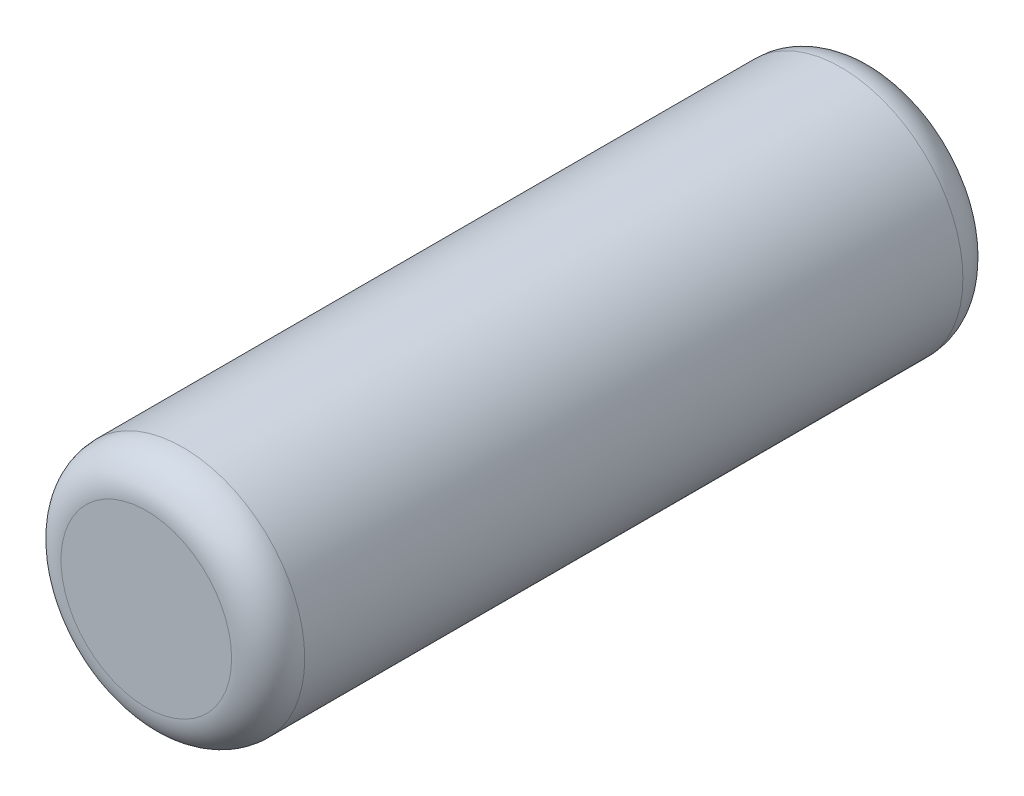
ISO-10303-21;
HEADER;
FILE_DESCRIPTION(('STEP AP214'),'2;1');
FILE_NAME('part.step','',(''),(''),'','','');
FILE_SCHEMA(('AUTOMOTIVE_DESIGN { 1 0 10303 214 1 1 1 1 }'));
ENDSEC;
DATA;
#1=APPLICATION_CONTEXT('core data for automotive mechanical design processes');
#2=APPLICATION_PROTOCOL_DEFINITION('international standard','automotive_design',2000,#1);
#3=PRODUCT_CONTEXT('',#1,'mechanical');
#4=PRODUCT('Part','Part','',(#3));
#5=PRODUCT_RELATED_PRODUCT_CATEGORY('part','',(#4));
#6=PRODUCT_DEFINITION_FORMATION('','',#4);
#7=PRODUCT_DEFINITION_CONTEXT('part definition',#1,'design');
#8=PRODUCT_DEFINITION('design','',#6,#7);
#9=PRODUCT_DEFINITION_SHAPE('','',#8);
#10=(LENGTH_UNIT() NAMED_UNIT(*) SI_UNIT(.MILLI.,.METRE.));
#11=(NAMED_UNIT(*) PLANE_ANGLE_UNIT() SI_UNIT($,.RADIAN.));
#12=(NAMED_UNIT(*) SI_UNIT($,.STERADIAN.) SOLID_ANGLE_UNIT());
#13=UNCERTAINTY_MEASURE_WITH_UNIT(LENGTH_MEASURE(1.E-05),#10,'distance_accuracy_value','');
#14=(GEOMETRIC_REPRESENTATION_CONTEXT(3) GLOBAL_UNCERTAINTY_ASSIGNED_CONTEXT((#13)) GLOBAL_UNIT_ASSIGNED_CONTEXT((#10,
#11,#12)) REPRESENTATION_CONTEXT('',''));
#15=CARTESIAN_POINT('',(0.,0.,0.));
#16=DIRECTION('',(0.,0.,1.));
#17=DIRECTION('',(1.,0.,0.));
#18=AXIS2_PLACEMENT_3D('',#15,#16,#17);
#19=CARTESIAN_POINT('',(0.,0.,3.));
#20=DIRECTION('',(0.,0.,-1.));
#21=DIRECTION('',(-1.,0.,0.));
#22=AXIS2_PLACEMENT_3D('',#19,#20,#21);
#23=CYLINDRICAL_SURFACE('',#22,0.999999999999999);
#24=CARTESIAN_POINT('',(0.,0.,-2.7));
#25=DIRECTION('',(0.,0.,1.));
#26=DIRECTION('',(1.,0.,0.));
#27=AXIS2_PLACEMENT_3D('',#24,#25,#26);
#28=CIRCLE('',#27,0.999999999999999);
#29=CARTESIAN_POINT('',(0.999999999999999,0.,-2.7));
#30=VERTEX_POINT('',#29);
#31=EDGE_CURVE('E39',#30,#30,#28,.T.);
#32=ORIENTED_EDGE('',*,*,#31,.T.);
#33=EDGE_LOOP('',(#32));
#34=FACE_BOUND('',#33,.T.);
#35=CARTESIAN_POINT('',(0.,0.,2.7));
#36=DIRECTION('',(0.,0.,1.));
#37=DIRECTION('',(1.,0.,0.));
#38=AXIS2_PLACEMENT_3D('',#35,#36,#37);
#39=CIRCLE('',#38,0.999999999999999);
#40=CARTESIAN_POINT('',(0.999999999999999,0.,2.7));
#41=VERTEX_POINT('',#40);
#42=EDGE_CURVE('E43',#41,#41,#39,.F.);
#43=ORIENTED_EDGE('',*,*,#42,.T.);
#44=EDGE_LOOP('',(#43));
#45=FACE_BOUND('',#44,.T.);
#46=ADVANCED_FACE('F32',(#34,#45),#23,.T.);
#47=CARTESIAN_POINT('',(0.,0.,3.));
#48=DIRECTION('',(0.,0.,1.));
#49=DIRECTION('',(1.,0.,0.));
#50=AXIS2_PLACEMENT_3D('',#47,#48,#49);
#51=PLANE('',#50);
#52=CARTESIAN_POINT('',(0.,0.,3.));
#53=DIRECTION('',(0.,0.,1.));
#54=DIRECTION('',(1.,0.,0.));
#55=AXIS2_PLACEMENT_3D('',#52,#53,#54);
#56=CIRCLE('',#55,0.699999999999999);
#57=CARTESIAN_POINT('',(0.699999999999999,0.,3.));
#58=VERTEX_POINT('',#57);
#59=EDGE_CURVE('E47',#58,#58,#56,.T.);
#60=ORIENTED_EDGE('',*,*,#59,.T.);
#61=EDGE_LOOP('',(#60));
#62=FACE_BOUND('',#61,.T.);
#63=ADVANCED_FACE('F53',(#62),#51,.T.);
#64=CARTESIAN_POINT('',(0.,0.,-3.));
#65=DIRECTION('',(0.,0.,1.));
#66=DIRECTION('',(1.,0.,0.));
#67=AXIS2_PLACEMENT_3D('',#64,#65,#66);
#68=PLANE('',#67);
#69=CARTESIAN_POINT('',(0.,0.,-3.));
#70=DIRECTION('',(0.,0.,1.));
#71=DIRECTION('',(1.,0.,0.));
#72=AXIS2_PLACEMENT_3D('',#69,#70,#71);
#73=CIRCLE('',#72,0.699999999999999);
#74=CARTESIAN_POINT('',(0.699999999999999,0.,-3.));
#75=VERTEX_POINT('',#74);
#76=EDGE_CURVE('E10',#75,#75,#73,.F.);
#77=ORIENTED_EDGE('',*,*,#76,.T.);
#78=EDGE_LOOP('',(#77));
#79=FACE_BOUND('',#78,.T.);
#80=ADVANCED_FACE('F57',(#79),#68,.F.);
#81=CARTESIAN_POINT('',(0.,0.,2.7));
#82=DIRECTION('',(0.,0.,1.));
#83=DIRECTION('',(1.,0.,0.));
#84=AXIS2_PLACEMENT_3D('',#81,#82,#83);
#85=TOROIDAL_SURFACE('',#84,0.699999999999999,0.3);
#86=ORIENTED_EDGE('',*,*,#42,.F.);
#87=EDGE_LOOP('',(#86));
#88=FACE_BOUND('',#87,.T.);
#89=ORIENTED_EDGE('',*,*,#59,.F.);
#90=EDGE_LOOP('',(#89));
#91=FACE_BOUND('',#90,.T.);
#92=ADVANCED_FACE('F55',(#88,#91),#85,.T.);
#93=CARTESIAN_POINT('',(0.,0.,-2.7));
#94=DIRECTION('',(0.,0.,1.));
#95=DIRECTION('',(1.,0.,0.));
#96=AXIS2_PLACEMENT_3D('',#93,#94,#95);
#97=TOROIDAL_SURFACE('',#96,0.699999999999999,0.3);
#98=ORIENTED_EDGE('',*,*,#76,.F.);
#99=EDGE_LOOP('',(#98));
#100=FACE_BOUND('',#99,.T.);
#101=ORIENTED_EDGE('',*,*,#31,.F.);
#102=EDGE_LOOP('',(#101));
#103=FACE_BOUND('',#102,.T.);
#104=ADVANCED_FACE('F34',(#100,#103),#97,.T.);
#105=CLOSED_SHELL('',(#46,#63,#80,#92,#104));
#106=MANIFOLD_SOLID_BREP('B2',#105);
#107=ADVANCED_BREP_SHAPE_REPRESENTATION('',(#18,#106),#14);
#108=SHAPE_DEFINITION_REPRESENTATION(#9,#107);
ENDSEC;
END-ISO-10303-21;
